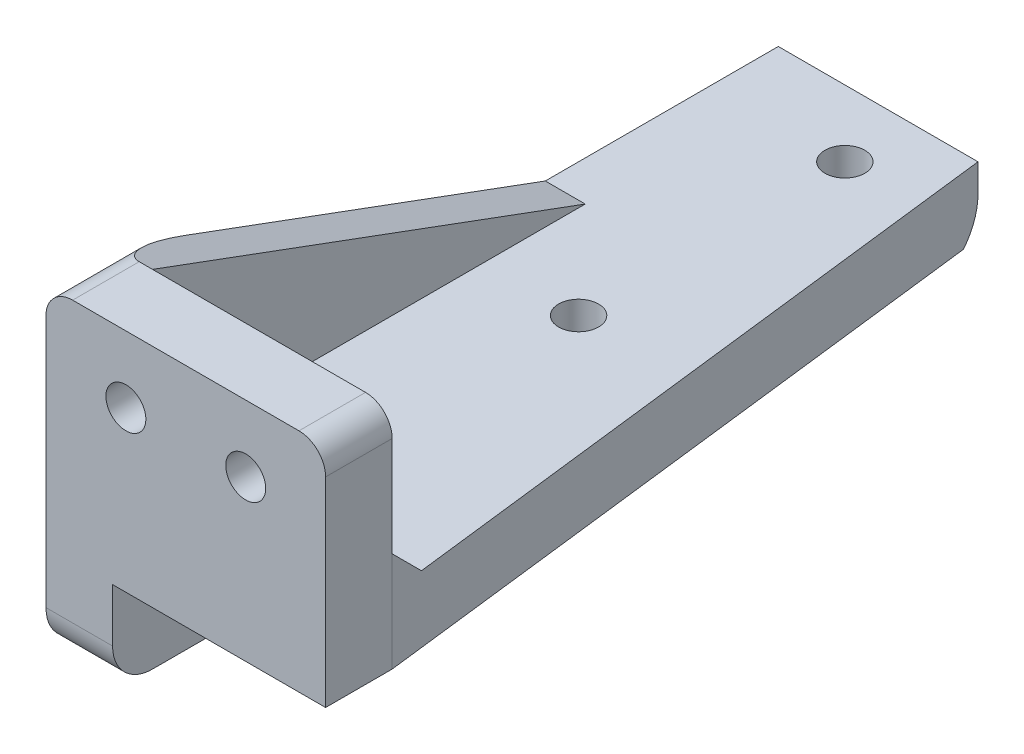
ISO-10303-21;
HEADER;
FILE_DESCRIPTION(('STEP AP214'),'2;1');
FILE_NAME('part.step','',(''),(''),'','','');
FILE_SCHEMA(('AUTOMOTIVE_DESIGN { 1 0 10303 214 1 1 1 1 }'));
ENDSEC;
DATA;
#1=APPLICATION_CONTEXT('core data for automotive mechanical design processes');
#2=APPLICATION_PROTOCOL_DEFINITION('international standard','automotive_design',2000,#1);
#3=PRODUCT_CONTEXT('',#1,'mechanical');
#4=PRODUCT('Part','Part','',(#3));
#5=PRODUCT_RELATED_PRODUCT_CATEGORY('part','',(#4));
#6=PRODUCT_DEFINITION_FORMATION('','',#4);
#7=PRODUCT_DEFINITION_CONTEXT('part definition',#1,'design');
#8=PRODUCT_DEFINITION('design','',#6,#7);
#9=PRODUCT_DEFINITION_SHAPE('','',#8);
#10=(LENGTH_UNIT() NAMED_UNIT(*) SI_UNIT(.MILLI.,.METRE.));
#11=(NAMED_UNIT(*) PLANE_ANGLE_UNIT() SI_UNIT($,.RADIAN.));
#12=(NAMED_UNIT(*) SI_UNIT($,.STERADIAN.) SOLID_ANGLE_UNIT());
#13=UNCERTAINTY_MEASURE_WITH_UNIT(LENGTH_MEASURE(1.E-05),#10,'distance_accuracy_value','');
#14=(GEOMETRIC_REPRESENTATION_CONTEXT(3) GLOBAL_UNCERTAINTY_ASSIGNED_CONTEXT((#13)) GLOBAL_UNIT_ASSIGNED_CONTEXT((#10,
#11,#12)) REPRESENTATION_CONTEXT('',''));
#15=CARTESIAN_POINT('',(0.,0.,0.));
#16=DIRECTION('',(0.,0.,1.));
#17=DIRECTION('',(1.,0.,0.));
#18=AXIS2_PLACEMENT_3D('',#15,#16,#17);
#19=CARTESIAN_POINT('',(0.,0.,0.));
#20=DIRECTION('',(0.,1.,0.));
#21=DIRECTION('',(0.,0.,1.));
#22=AXIS2_PLACEMENT_3D('',#19,#20,#21);
#23=PLANE('',#22);
#24=CARTESIAN_POINT('',(2.5,0.,20.));
#25=DIRECTION('',(0.,-1.,0.));
#26=DIRECTION('',(0.,0.,-1.));
#27=AXIS2_PLACEMENT_3D('',#24,#25,#26);
#28=CIRCLE('',#27,1.5);
#29=CARTESIAN_POINT('',(2.5,0.,18.5));
#30=VERTEX_POINT('',#29);
#31=EDGE_CURVE('E261',#30,#30,#28,.T.);
#32=ORIENTED_EDGE('',*,*,#31,.F.);
#33=EDGE_LOOP('',(#32));
#34=FACE_BOUND('',#33,.T.);
#35=CARTESIAN_POINT('',(2.5,0.,0.));
#36=DIRECTION('',(0.,-1.,0.));
#37=DIRECTION('',(0.,0.,-1.));
#38=AXIS2_PLACEMENT_3D('',#35,#36,#37);
#39=CIRCLE('',#38,1.5);
#40=CARTESIAN_POINT('',(2.5,0.,-1.50000000000001));
#41=VERTEX_POINT('',#40);
#42=EDGE_CURVE('E265',#41,#41,#39,.T.);
#43=ORIENTED_EDGE('',*,*,#42,.F.);
#44=EDGE_LOOP('',(#43));
#45=FACE_BOUND('',#44,.T.);
#46=CARTESIAN_POINT('',(2.5,0.,-20.));
#47=DIRECTION('',(0.,-1.,0.));
#48=DIRECTION('',(0.,0.,-1.));
#49=AXIS2_PLACEMENT_3D('',#46,#47,#48);
#50=CIRCLE('',#49,1.5);
#51=CARTESIAN_POINT('',(2.5,0.,-21.5));
#52=VERTEX_POINT('',#51);
#53=EDGE_CURVE('E273',#52,#52,#50,.T.);
#54=ORIENTED_EDGE('',*,*,#53,.F.);
#55=EDGE_LOOP('',(#54));
#56=FACE_BOUND('',#55,.T.);
#57=DIRECTION('',(0.,0.,1.));
#58=VECTOR('',#57,1.);
#59=CARTESIAN_POINT('',(-2.5,0.,0.));
#60=LINE('',#59,#58);
#61=CARTESIAN_POINT('',(-2.5,0.,-23.7536792787917));
#62=VERTEX_POINT('',#61);
#63=CARTESIAN_POINT('',(-2.5,0.,30.));
#64=VERTEX_POINT('',#63);
#65=EDGE_CURVE('E291',#62,#64,#60,.T.);
#66=ORIENTED_EDGE('',*,*,#65,.F.);
#67=DIRECTION('',(-1.,0.,0.));
#68=VECTOR('',#67,1.);
#69=CARTESIAN_POINT('',(-2.5,0.,-23.7536792787917));
#70=LINE('',#69,#68);
#71=CARTESIAN_POINT('',(7.649558486545,0.,-23.7536792787917));
#72=VERTEX_POINT('',#71);
#73=EDGE_CURVE('E345',#62,#72,#70,.F.);
#74=ORIENTED_EDGE('',*,*,#73,.T.);
#75=DIRECTION('',(-0.119145220618431,0.,-0.992876838486922));
#76=VECTOR('',#75,1.);
#77=CARTESIAN_POINT('',(10.3509463722397,0.,-1.24211356466877));
#78=LINE('',#77,#76);
#79=CARTESIAN_POINT('',(13.5,0.,25.));
#80=VERTEX_POINT('',#79);
#81=EDGE_CURVE('E307',#80,#72,#78,.T.);
#82=ORIENTED_EDGE('',*,*,#81,.F.);
#83=DIRECTION('',(0.,0.,-1.));
#84=VECTOR('',#83,1.);
#85=CARTESIAN_POINT('',(13.5,0.,30.));
#86=LINE('',#85,#84);
#87=CARTESIAN_POINT('',(13.5,0.,30.));
#88=VERTEX_POINT('',#87);
#89=EDGE_CURVE('E247',#88,#80,#86,.T.);
#90=ORIENTED_EDGE('',*,*,#89,.F.);
#91=DIRECTION('',(1.,0.,0.));
#92=VECTOR('',#91,1.);
#93=CARTESIAN_POINT('',(13.5,0.,30.));
#94=LINE('',#93,#92);
#95=EDGE_CURVE('E243',#64,#88,#94,.T.);
#96=ORIENTED_EDGE('',*,*,#95,.F.);
#97=EDGE_LOOP('',(#66,#74,#82,#90,#96));
#98=FACE_BOUND('',#97,.T.);
#99=ADVANCED_FACE('F49',(#34,#45,#56,#98),#23,.F.);
#100=CARTESIAN_POINT('',(10.3509463722397,5.,-1.24211356466877));
#101=DIRECTION('',(-0.992876838486922,0.,0.119145220618431));
#102=DIRECTION('',(0.119145220618431,0.,0.992876838486922));
#103=AXIS2_PLACEMENT_3D('',#100,#101,#102);
#104=PLANE('',#103);
#105=ORIENTED_EDGE('',*,*,#81,.T.);
#106=CARTESIAN_POINT('',(7.98,2.90124980474851,-21.));
#107=DIRECTION('',(-0.992876838486922,0.,0.119145220618431));
#108=DIRECTION('',(-0.119145220618431,0.,-0.992876838486922));
#109=AXIS2_PLACEMENT_3D('',#106,#107,#108);
#110=ELLIPSE('',#109,4.02869705984453,4.);
#111=CARTESIAN_POINT('',(7.5,2.90124980474851,-25.));
#112=VERTEX_POINT('',#111);
#113=EDGE_CURVE('E348',#72,#112,#110,.F.);
#114=ORIENTED_EDGE('',*,*,#113,.T.);
#115=DIRECTION('',(0.,-1.,0.));
#116=VECTOR('',#115,1.);
#117=CARTESIAN_POINT('',(7.5,5.,-25.));
#118=LINE('',#117,#116);
#119=CARTESIAN_POINT('',(7.5,5.,-25.));
#120=VERTEX_POINT('',#119);
#121=EDGE_CURVE('E324',#120,#112,#118,.T.);
#122=ORIENTED_EDGE('',*,*,#121,.F.);
#123=DIRECTION('',(-0.119145220618431,0.,-0.992876838486922));
#124=VECTOR('',#123,1.);
#125=CARTESIAN_POINT('',(10.3509463722397,5.,-1.24211356466877));
#126=LINE('',#125,#124);
#127=CARTESIAN_POINT('',(13.2,5.,22.5));
#128=VERTEX_POINT('',#127);
#129=EDGE_CURVE('E308',#128,#120,#126,.T.);
#130=ORIENTED_EDGE('',*,*,#129,.F.);
#131=DIRECTION('',(-0.0845489833163317,-0.704574860969423,-0.704574860969431));
#132=VECTOR('',#131,1.);
#133=CARTESIAN_POINT('',(11.7652899126291,-6.95591739475773,10.5440826052421));
#134=LINE('',#133,#132);
#135=CARTESIAN_POINT('',(13.5,7.5,25.));
#136=VERTEX_POINT('',#135);
#137=EDGE_CURVE('E373',#128,#136,#134,.F.);
#138=ORIENTED_EDGE('',*,*,#137,.T.);
#139=DIRECTION('',(0.,-1.,0.));
#140=VECTOR('',#139,1.);
#141=CARTESIAN_POINT('',(13.5,5.,25.));
#142=LINE('',#141,#140);
#143=EDGE_CURVE('E328',#136,#80,#142,.T.);
#144=ORIENTED_EDGE('',*,*,#143,.T.);
#145=EDGE_LOOP('',(#105,#114,#122,#130,#138,#144));
#146=FACE_BOUND('',#145,.T.);
#147=ADVANCED_FACE('F427',(#146),#104,.F.);
#148=CARTESIAN_POINT('',(0.,5.,-25.));
#149=DIRECTION('',(0.,0.,-1.));
#150=DIRECTION('',(-1.,0.,0.));
#151=AXIS2_PLACEMENT_3D('',#148,#149,#150);
#152=PLANE('',#151);
#153=ORIENTED_EDGE('',*,*,#121,.T.);
#154=DIRECTION('',(-1.,0.,0.));
#155=VECTOR('',#154,1.);
#156=CARTESIAN_POINT('',(0.,2.90124980474851,-25.));
#157=LINE('',#156,#155);
#158=CARTESIAN_POINT('',(-7.5,2.90124980474851,-25.));
#159=VERTEX_POINT('',#158);
#160=EDGE_CURVE('E332',#112,#159,#157,.T.);
#161=ORIENTED_EDGE('',*,*,#160,.T.);
#162=DIRECTION('',(0.,-1.,0.));
#163=VECTOR('',#162,1.);
#164=CARTESIAN_POINT('',(-7.5,5.,-25.));
#165=LINE('',#164,#163);
#166=CARTESIAN_POINT('',(-7.5,5.,-25.));
#167=VERTEX_POINT('',#166);
#168=EDGE_CURVE('E317',#167,#159,#165,.T.);
#169=ORIENTED_EDGE('',*,*,#168,.F.);
#170=DIRECTION('',(1.,0.,0.));
#171=VECTOR('',#170,1.);
#172=CARTESIAN_POINT('',(0.,5.,-25.));
#173=LINE('',#172,#171);
#174=EDGE_CURVE('E311',#167,#120,#173,.T.);
#175=ORIENTED_EDGE('',*,*,#174,.T.);
#176=EDGE_LOOP('',(#153,#161,#169,#175));
#177=FACE_BOUND('',#176,.T.);
#178=ADVANCED_FACE('F431',(#177),#152,.T.);
#179=CARTESIAN_POINT('',(-7.5,5.,0.));
#180=DIRECTION('',(-1.,0.,0.));
#181=DIRECTION('',(0.,0.,1.));
#182=AXIS2_PLACEMENT_3D('',#179,#180,#181);
#183=PLANE('',#182);
#184=DIRECTION('',(0.,-1.,0.));
#185=VECTOR('',#184,1.);
#186=CARTESIAN_POINT('',(-7.5,5.,30.));
#187=LINE('',#186,#185);
#188=CARTESIAN_POINT('',(-7.5,15.,30.));
#189=VERTEX_POINT('',#188);
#190=CARTESIAN_POINT('',(-7.5,-4.,30.));
#191=VERTEX_POINT('',#190);
#192=EDGE_CURVE('E237',#189,#191,#187,.T.);
#193=ORIENTED_EDGE('',*,*,#192,.F.);
#194=DIRECTION('',(0.,0.,-1.));
#195=VECTOR('',#194,1.);
#196=CARTESIAN_POINT('',(-7.5,15.,25.));
#197=LINE('',#196,#195);
#198=CARTESIAN_POINT('',(-7.5,15.,19.5833333333333));
#199=VERTEX_POINT('',#198);
#200=EDGE_CURVE('E58',#189,#199,#197,.T.);
#201=ORIENTED_EDGE('',*,*,#200,.T.);
#202=DIRECTION('',(0.,-0.346374082759158,-0.938096474139388));
#203=VECTOR('',#202,1.);
#204=CARTESIAN_POINT('',(-7.5,5.,-7.50000000000002));
#205=LINE('',#204,#203);
#206=CARTESIAN_POINT('',(-7.5,5.,-7.50000000000002));
#207=VERTEX_POINT('',#206);
#208=EDGE_CURVE('E197',#199,#207,#205,.T.);
#209=ORIENTED_EDGE('',*,*,#208,.T.);
#210=DIRECTION('',(0.,0.,-1.));
#211=VECTOR('',#210,1.);
#212=CARTESIAN_POINT('',(-7.5,5.,0.));
#213=LINE('',#212,#211);
#214=EDGE_CURVE('E202',#207,#167,#213,.T.);
#215=ORIENTED_EDGE('',*,*,#214,.T.);
#216=ORIENTED_EDGE('',*,*,#168,.T.);
#217=CARTESIAN_POINT('',(-7.5,2.90124980474851,-21.));
#218=DIRECTION('',(-1.,0.,0.));
#219=DIRECTION('',(0.,0.,1.));
#220=AXIS2_PLACEMENT_3D('',#217,#218,#219);
#221=CIRCLE('',#220,4.);
#222=CARTESIAN_POINT('',(-7.5,-1.09750078088398,-21.0999687646408));
#223=VERTEX_POINT('',#222);
#224=EDGE_CURVE('E336',#159,#223,#221,.T.);
#225=ORIENTED_EDGE('',*,*,#224,.T.);
#226=DIRECTION('',(0.,-0.0249921911602029,0.999687646408123));
#227=VECTOR('',#226,1.);
#228=CARTESIAN_POINT('',(-7.5,-1.62398500936915,-0.0405996252342284));
#229=LINE('',#228,#227);
#230=CARTESIAN_POINT('',(-7.5,-2.,15.));
#231=VERTEX_POINT('',#230);
#232=EDGE_CURVE('E260',#223,#231,#229,.T.);
#233=ORIENTED_EDGE('',*,*,#232,.T.);
#234=DIRECTION('',(0.,1.,0.));
#235=VECTOR('',#234,1.);
#236=CARTESIAN_POINT('',(-7.5,0.,15.));
#237=LINE('',#236,#235);
#238=CARTESIAN_POINT('',(-7.5,-5.,15.));
#239=VERTEX_POINT('',#238);
#240=EDGE_CURVE('E299',#239,#231,#237,.T.);
#241=ORIENTED_EDGE('',*,*,#240,.F.);
#242=CARTESIAN_POINT('',(-7.5,-5.,17.));
#243=DIRECTION('',(-1.,0.,0.));
#244=DIRECTION('',(0.,0.,1.));
#245=AXIS2_PLACEMENT_3D('',#242,#243,#244);
#246=CIRCLE('',#245,2.);
#247=CARTESIAN_POINT('',(-7.5,-7.,17.));
#248=VERTEX_POINT('',#247);
#249=EDGE_CURVE('E355',#239,#248,#246,.T.);
#250=ORIENTED_EDGE('',*,*,#249,.T.);
#251=DIRECTION('',(0.,0.,-1.));
#252=VECTOR('',#251,1.);
#253=CARTESIAN_POINT('',(-7.5,-7.,0.));
#254=LINE('',#253,#252);
#255=CARTESIAN_POINT('',(-7.5,-7.,27.));
#256=VERTEX_POINT('',#255);
#257=EDGE_CURVE('E285',#256,#248,#254,.T.);
#258=ORIENTED_EDGE('',*,*,#257,.F.);
#259=CARTESIAN_POINT('',(-7.5,-4.,27.));
#260=DIRECTION('',(-1.,0.,0.));
#261=DIRECTION('',(0.,0.,1.));
#262=AXIS2_PLACEMENT_3D('',#259,#260,#261);
#263=CIRCLE('',#262,3.);
#264=EDGE_CURVE('E387',#256,#191,#263,.T.);
#265=ORIENTED_EDGE('',*,*,#264,.T.);
#266=EDGE_LOOP('',(#193,#201,#209,#215,#216,#225,#233,#241,#250,#258,#265));
#267=FACE_BOUND('',#266,.T.);
#268=ADVANCED_FACE('F410',(#267),#183,.T.);
#269=CARTESIAN_POINT('',(0.,5.,0.));
#270=DIRECTION('',(0.,1.,0.));
#271=DIRECTION('',(0.,0.,1.));
#272=AXIS2_PLACEMENT_3D('',#269,#270,#271);
#273=PLANE('',#272);
#274=DIRECTION('',(-1.,0.,0.));
#275=VECTOR('',#274,1.);
#276=CARTESIAN_POINT('',(-4.5,5.,-7.50000000000002));
#277=LINE('',#276,#275);
#278=CARTESIAN_POINT('',(-4.5,5.,-7.50000000000002));
#279=VERTEX_POINT('',#278);
#280=EDGE_CURVE('E192',#279,#207,#277,.T.);
#281=ORIENTED_EDGE('',*,*,#280,.F.);
#282=DIRECTION('',(0.,0.,1.));
#283=VECTOR('',#282,1.);
#284=CARTESIAN_POINT('',(-4.5,5.,22.5));
#285=LINE('',#284,#283);
#286=CARTESIAN_POINT('',(-4.5,5.,22.5));
#287=VERTEX_POINT('',#286);
#288=EDGE_CURVE('E175',#279,#287,#285,.T.);
#289=ORIENTED_EDGE('',*,*,#288,.T.);
#290=DIRECTION('',(1.,0.,0.));
#291=VECTOR('',#290,1.);
#292=CARTESIAN_POINT('',(13.5,5.,22.5));
#293=LINE('',#292,#291);
#294=EDGE_CURVE('E366',#287,#128,#293,.T.);
#295=ORIENTED_EDGE('',*,*,#294,.T.);
#296=ORIENTED_EDGE('',*,*,#129,.T.);
#297=ORIENTED_EDGE('',*,*,#174,.F.);
#298=ORIENTED_EDGE('',*,*,#214,.F.);
#299=EDGE_LOOP('',(#281,#289,#295,#296,#297,#298));
#300=FACE_BOUND('',#299,.T.);
#301=CARTESIAN_POINT('',(2.5,5.,20.));
#302=DIRECTION('',(0.,-1.,0.));
#303=DIRECTION('',(0.,0.,-1.));
#304=AXIS2_PLACEMENT_3D('',#301,#302,#303);
#305=CIRCLE('',#304,1.5);
#306=CARTESIAN_POINT('',(2.5,5.,18.5));
#307=VERTEX_POINT('',#306);
#308=EDGE_CURVE('E256',#307,#307,#305,.T.);
#309=ORIENTED_EDGE('',*,*,#308,.T.);
#310=EDGE_LOOP('',(#309));
#311=FACE_BOUND('',#310,.T.);
#312=CARTESIAN_POINT('',(2.5,5.,0.));
#313=DIRECTION('',(0.,-1.,0.));
#314=DIRECTION('',(0.,0.,-1.));
#315=AXIS2_PLACEMENT_3D('',#312,#313,#314);
#316=CIRCLE('',#315,1.5);
#317=CARTESIAN_POINT('',(2.5,5.,-1.50000000000001));
#318=VERTEX_POINT('',#317);
#319=EDGE_CURVE('E269',#318,#318,#316,.T.);
#320=ORIENTED_EDGE('',*,*,#319,.T.);
#321=EDGE_LOOP('',(#320));
#322=FACE_BOUND('',#321,.T.);
#323=CARTESIAN_POINT('',(2.5,5.,-20.));
#324=DIRECTION('',(0.,-1.,0.));
#325=DIRECTION('',(0.,0.,-1.));
#326=AXIS2_PLACEMENT_3D('',#323,#324,#325);
#327=CIRCLE('',#326,1.5);
#328=CARTESIAN_POINT('',(2.5,5.,-21.5));
#329=VERTEX_POINT('',#328);
#330=EDGE_CURVE('E255',#329,#329,#327,.T.);
#331=ORIENTED_EDGE('',*,*,#330,.T.);
#332=EDGE_LOOP('',(#331));
#333=FACE_BOUND('',#332,.T.);
#334=ADVANCED_FACE('F199',(#300,#311,#322,#333),#273,.T.);
#335=CARTESIAN_POINT('',(-2.5,-7.,0.));
#336=DIRECTION('',(0.,1.,0.));
#337=DIRECTION('',(0.,0.,1.));
#338=AXIS2_PLACEMENT_3D('',#335,#336,#337);
#339=PLANE('',#338);
#340=DIRECTION('',(0.,0.,-1.));
#341=VECTOR('',#340,1.);
#342=CARTESIAN_POINT('',(-2.5,-7.,0.));
#343=LINE('',#342,#341);
#344=CARTESIAN_POINT('',(-2.5,-7.,27.));
#345=VERTEX_POINT('',#344);
#346=CARTESIAN_POINT('',(-2.5,-7.,17.));
#347=VERTEX_POINT('',#346);
#348=EDGE_CURVE('E288',#345,#347,#343,.T.);
#349=ORIENTED_EDGE('',*,*,#348,.F.);
#350=DIRECTION('',(1.,0.,0.));
#351=VECTOR('',#350,1.);
#352=CARTESIAN_POINT('',(-2.5,-7.,27.));
#353=LINE('',#352,#351);
#354=EDGE_CURVE('E384',#345,#256,#353,.F.);
#355=ORIENTED_EDGE('',*,*,#354,.T.);
#356=ORIENTED_EDGE('',*,*,#257,.T.);
#357=DIRECTION('',(-1.,0.,0.));
#358=VECTOR('',#357,1.);
#359=CARTESIAN_POINT('',(-2.5,-7.,17.));
#360=LINE('',#359,#358);
#361=EDGE_CURVE('E359',#248,#347,#360,.F.);
#362=ORIENTED_EDGE('',*,*,#361,.T.);
#363=EDGE_LOOP('',(#349,#355,#356,#362));
#364=FACE_BOUND('',#363,.T.);
#365=ADVANCED_FACE('F461',(#364),#339,.F.);
#366=CARTESIAN_POINT('',(-2.5,0.,15.));
#367=DIRECTION('',(0.,0.,1.));
#368=DIRECTION('',(0.,-1.,0.));
#369=AXIS2_PLACEMENT_3D('',#366,#367,#368);
#370=PLANE('',#369);
#371=DIRECTION('',(0.,1.,0.));
#372=VECTOR('',#371,1.);
#373=CARTESIAN_POINT('',(-2.5,0.,15.));
#374=LINE('',#373,#372);
#375=CARTESIAN_POINT('',(-2.5,-5.,15.));
#376=VERTEX_POINT('',#375);
#377=CARTESIAN_POINT('',(-2.5,-2.,15.));
#378=VERTEX_POINT('',#377);
#379=EDGE_CURVE('E284',#376,#378,#374,.T.);
#380=ORIENTED_EDGE('',*,*,#379,.F.);
#381=DIRECTION('',(-1.,0.,0.));
#382=VECTOR('',#381,1.);
#383=CARTESIAN_POINT('',(-2.5,-5.,15.));
#384=LINE('',#383,#382);
#385=EDGE_CURVE('E351',#376,#239,#384,.T.);
#386=ORIENTED_EDGE('',*,*,#385,.T.);
#387=ORIENTED_EDGE('',*,*,#240,.T.);
#388=DIRECTION('',(-1.,0.,0.));
#389=VECTOR('',#388,1.);
#390=CARTESIAN_POINT('',(-2.5,-2.,15.));
#391=LINE('',#390,#389);
#392=EDGE_CURVE('E295',#378,#231,#391,.T.);
#393=ORIENTED_EDGE('',*,*,#392,.F.);
#394=EDGE_LOOP('',(#380,#386,#387,#393));
#395=FACE_BOUND('',#394,.T.);
#396=ADVANCED_FACE('F472',(#395),#370,.F.);
#397=CARTESIAN_POINT('',(-2.5,-1.62398500936915,-0.0405996252342284));
#398=DIRECTION('',(0.,-0.999687646408123,-0.0249921911602029));
#399=DIRECTION('',(0.,0.0249921911602029,-0.999687646408123));
#400=AXIS2_PLACEMENT_3D('',#397,#398,#399);
#401=PLANE('',#400);
#402=ORIENTED_EDGE('',*,*,#232,.F.);
#403=DIRECTION('',(-1.,0.,0.));
#404=VECTOR('',#403,1.);
#405=CARTESIAN_POINT('',(-2.5,-1.09750078088398,-21.0999687646408));
#406=LINE('',#405,#404);
#407=CARTESIAN_POINT('',(-2.5,-1.09750078088398,-21.0999687646408));
#408=VERTEX_POINT('',#407);
#409=EDGE_CURVE('E339',#223,#408,#406,.F.);
#410=ORIENTED_EDGE('',*,*,#409,.T.);
#411=DIRECTION('',(0.,-0.0249921911602029,0.999687646408123));
#412=VECTOR('',#411,1.);
#413=CARTESIAN_POINT('',(-2.5,-1.62398500936915,-0.0405996252342284));
#414=LINE('',#413,#412);
#415=EDGE_CURVE('E280',#408,#378,#414,.T.);
#416=ORIENTED_EDGE('',*,*,#415,.T.);
#417=ORIENTED_EDGE('',*,*,#392,.T.);
#418=EDGE_LOOP('',(#402,#410,#416,#417));
#419=FACE_BOUND('',#418,.T.);
#420=ADVANCED_FACE('F438',(#419),#401,.T.);
#421=CARTESIAN_POINT('',(-2.5,0.,0.));
#422=DIRECTION('',(-1.,0.,0.));
#423=DIRECTION('',(0.,0.,1.));
#424=AXIS2_PLACEMENT_3D('',#421,#422,#423);
#425=PLANE('',#424);
#426=DIRECTION('',(0.,1.,0.));
#427=VECTOR('',#426,1.);
#428=CARTESIAN_POINT('',(-2.5,0.,30.));
#429=LINE('',#428,#427);
#430=CARTESIAN_POINT('',(-2.5,-4.,30.));
#431=VERTEX_POINT('',#430);
#432=EDGE_CURVE('E240',#431,#64,#429,.T.);
#433=ORIENTED_EDGE('',*,*,#432,.F.);
#434=CARTESIAN_POINT('',(-2.5,-4.,27.));
#435=DIRECTION('',(-1.,0.,0.));
#436=DIRECTION('',(0.,0.,1.));
#437=AXIS2_PLACEMENT_3D('',#434,#435,#436);
#438=CIRCLE('',#437,3.);
#439=EDGE_CURVE('E381',#431,#345,#438,.F.);
#440=ORIENTED_EDGE('',*,*,#439,.T.);
#441=ORIENTED_EDGE('',*,*,#348,.T.);
#442=CARTESIAN_POINT('',(-2.5,-5.,17.));
#443=DIRECTION('',(-1.,0.,0.));
#444=DIRECTION('',(0.,0.,1.));
#445=AXIS2_PLACEMENT_3D('',#442,#443,#444);
#446=CIRCLE('',#445,2.);
#447=EDGE_CURVE('E363',#347,#376,#446,.F.);
#448=ORIENTED_EDGE('',*,*,#447,.T.);
#449=ORIENTED_EDGE('',*,*,#379,.T.);
#450=ORIENTED_EDGE('',*,*,#415,.F.);
#451=CARTESIAN_POINT('',(-2.5,2.90124980474851,-21.));
#452=DIRECTION('',(-1.,0.,0.));
#453=DIRECTION('',(0.,0.,1.));
#454=AXIS2_PLACEMENT_3D('',#451,#452,#453);
#455=CIRCLE('',#454,4.);
#456=EDGE_CURVE('E342',#408,#62,#455,.F.);
#457=ORIENTED_EDGE('',*,*,#456,.T.);
#458=ORIENTED_EDGE('',*,*,#65,.T.);
#459=EDGE_LOOP('',(#433,#440,#441,#448,#449,#450,#457,#458));
#460=FACE_BOUND('',#459,.T.);
#461=ADVANCED_FACE('F448',(#460),#425,.F.);
#462=CARTESIAN_POINT('',(0.,2.90124980474851,-21.));
#463=DIRECTION('',(-1.,0.,0.));
#464=DIRECTION('',(0.,0.,1.));
#465=AXIS2_PLACEMENT_3D('',#462,#463,#464);
#466=CYLINDRICAL_SURFACE('',#465,4.);
#467=ORIENTED_EDGE('',*,*,#456,.F.);
#468=ORIENTED_EDGE('',*,*,#409,.F.);
#469=ORIENTED_EDGE('',*,*,#224,.F.);
#470=ORIENTED_EDGE('',*,*,#160,.F.);
#471=ORIENTED_EDGE('',*,*,#113,.F.);
#472=ORIENTED_EDGE('',*,*,#73,.F.);
#473=EDGE_LOOP('',(#467,#468,#469,#470,#471,#472));
#474=FACE_BOUND('',#473,.T.);
#475=ADVANCED_FACE('F442',(#474),#466,.T.);
#476=CARTESIAN_POINT('',(-2.5,-5.,17.));
#477=DIRECTION('',(-1.,0.,0.));
#478=DIRECTION('',(0.,0.,1.));
#479=AXIS2_PLACEMENT_3D('',#476,#477,#478);
#480=CYLINDRICAL_SURFACE('',#479,2.);
#481=ORIENTED_EDGE('',*,*,#447,.F.);
#482=ORIENTED_EDGE('',*,*,#361,.F.);
#483=ORIENTED_EDGE('',*,*,#249,.F.);
#484=ORIENTED_EDGE('',*,*,#385,.F.);
#485=EDGE_LOOP('',(#481,#482,#483,#484));
#486=FACE_BOUND('',#485,.T.);
#487=ADVANCED_FACE('F469',(#486),#480,.T.);
#488=CARTESIAN_POINT('',(2.5,5.,-20.));
#489=DIRECTION('',(0.,-1.,0.));
#490=DIRECTION('',(0.,0.,-1.));
#491=AXIS2_PLACEMENT_3D('',#488,#489,#490);
#492=CYLINDRICAL_SURFACE('',#491,1.5);
#493=ORIENTED_EDGE('',*,*,#330,.F.);
#494=EDGE_LOOP('',(#493));
#495=FACE_BOUND('',#494,.T.);
#496=ORIENTED_EDGE('',*,*,#53,.T.);
#497=EDGE_LOOP('',(#496));
#498=FACE_BOUND('',#497,.T.);
#499=ADVANCED_FACE('F500',(#495,#498),#492,.F.);
#500=CARTESIAN_POINT('',(2.5,5.,0.));
#501=DIRECTION('',(0.,-1.,0.));
#502=DIRECTION('',(0.,0.,-1.));
#503=AXIS2_PLACEMENT_3D('',#500,#501,#502);
#504=CYLINDRICAL_SURFACE('',#503,1.5);
#505=ORIENTED_EDGE('',*,*,#319,.F.);
#506=EDGE_LOOP('',(#505));
#507=FACE_BOUND('',#506,.T.);
#508=ORIENTED_EDGE('',*,*,#42,.T.);
#509=EDGE_LOOP('',(#508));
#510=FACE_BOUND('',#509,.T.);
#511=ADVANCED_FACE('F535',(#507,#510),#504,.F.);
#512=CARTESIAN_POINT('',(2.5,5.,20.));
#513=DIRECTION('',(0.,-1.,0.));
#514=DIRECTION('',(0.,0.,-1.));
#515=AXIS2_PLACEMENT_3D('',#512,#513,#514);
#516=CYLINDRICAL_SURFACE('',#515,1.5);
#517=ORIENTED_EDGE('',*,*,#308,.F.);
#518=EDGE_LOOP('',(#517));
#519=FACE_BOUND('',#518,.T.);
#520=ORIENTED_EDGE('',*,*,#31,.T.);
#521=EDGE_LOOP('',(#520));
#522=FACE_BOUND('',#521,.T.);
#523=ADVANCED_FACE('F532',(#519,#522),#516,.F.);
#524=CARTESIAN_POINT('',(0.,0.,25.));
#525=DIRECTION('',(0.,0.,-1.));
#526=DIRECTION('',(-1.,0.,0.));
#527=AXIS2_PLACEMENT_3D('',#524,#525,#526);
#528=PLANE('',#527);
#529=DIRECTION('',(-1.,0.,0.));
#530=VECTOR('',#529,1.);
#531=CARTESIAN_POINT('',(-7.5,17.,25.));
#532=LINE('',#531,#530);
#533=CARTESIAN_POINT('',(11.5,17.,25.));
#534=VERTEX_POINT('',#533);
#535=CARTESIAN_POINT('',(-4.5,17.,25.));
#536=VERTEX_POINT('',#535);
#537=EDGE_CURVE('E225',#534,#536,#532,.T.);
#538=ORIENTED_EDGE('',*,*,#537,.F.);
#539=CARTESIAN_POINT('',(11.5,15.,25.));
#540=DIRECTION('',(0.,0.,-1.));
#541=DIRECTION('',(-1.,0.,0.));
#542=AXIS2_PLACEMENT_3D('',#539,#540,#541);
#543=CIRCLE('',#542,2.);
#544=CARTESIAN_POINT('',(13.5,15.,25.));
#545=VERTEX_POINT('',#544);
#546=EDGE_CURVE('E398',#534,#545,#543,.T.);
#547=ORIENTED_EDGE('',*,*,#546,.T.);
#548=DIRECTION('',(0.,1.,0.));
#549=VECTOR('',#548,1.);
#550=CARTESIAN_POINT('',(13.5,5.,25.));
#551=LINE('',#550,#549);
#552=EDGE_CURVE('E234',#136,#545,#551,.T.);
#553=ORIENTED_EDGE('',*,*,#552,.F.);
#554=DIRECTION('',(-1.,0.,0.));
#555=VECTOR('',#554,1.);
#556=CARTESIAN_POINT('',(-7.5,7.5,25.));
#557=LINE('',#556,#555);
#558=CARTESIAN_POINT('',(-4.5,7.5,25.));
#559=VERTEX_POINT('',#558);
#560=EDGE_CURVE('E369',#136,#559,#557,.T.);
#561=ORIENTED_EDGE('',*,*,#560,.T.);
#562=DIRECTION('',(0.,1.,0.));
#563=VECTOR('',#562,1.);
#564=CARTESIAN_POINT('',(-4.5,17.,25.));
#565=LINE('',#564,#563);
#566=EDGE_CURVE('E204',#559,#536,#565,.T.);
#567=ORIENTED_EDGE('',*,*,#566,.T.);
#568=EDGE_LOOP('',(#538,#547,#553,#561,#567));
#569=FACE_BOUND('',#568,.T.);
#570=CARTESIAN_POINT('',(7.5,12.,25.));
#571=DIRECTION('',(0.,0.,1.));
#572=DIRECTION('',(1.,0.,0.));
#573=AXIS2_PLACEMENT_3D('',#570,#571,#572);
#574=CIRCLE('',#573,1.5);
#575=CARTESIAN_POINT('',(9.,12.,25.));
#576=VERTEX_POINT('',#575);
#577=EDGE_CURVE('E208',#576,#576,#574,.T.);
#578=ORIENTED_EDGE('',*,*,#577,.T.);
#579=EDGE_LOOP('',(#578));
#580=FACE_BOUND('',#579,.T.);
#581=CARTESIAN_POINT('',(-1.5,12.,25.));
#582=DIRECTION('',(0.,0.,1.));
#583=DIRECTION('',(1.,0.,0.));
#584=AXIS2_PLACEMENT_3D('',#581,#582,#583);
#585=CIRCLE('',#584,1.5);
#586=CARTESIAN_POINT('',(0.,12.,25.));
#587=VERTEX_POINT('',#586);
#588=EDGE_CURVE('E217',#587,#587,#585,.T.);
#589=ORIENTED_EDGE('',*,*,#588,.T.);
#590=EDGE_LOOP('',(#589));
#591=FACE_BOUND('',#590,.T.);
#592=ADVANCED_FACE('F421',(#569,#580,#591),#528,.T.);
#593=CARTESIAN_POINT('',(0.,0.,30.));
#594=DIRECTION('',(0.,0.,-1.));
#595=DIRECTION('',(-1.,0.,0.));
#596=AXIS2_PLACEMENT_3D('',#593,#594,#595);
#597=PLANE('',#596);
#598=DIRECTION('',(0.,1.,0.));
#599=VECTOR('',#598,1.);
#600=CARTESIAN_POINT('',(13.5,17.,30.));
#601=LINE('',#600,#599);
#602=CARTESIAN_POINT('',(13.5,15.,30.));
#603=VERTEX_POINT('',#602);
#604=EDGE_CURVE('E229',#88,#603,#601,.T.);
#605=ORIENTED_EDGE('',*,*,#604,.T.);
#606=CARTESIAN_POINT('',(11.5,15.,30.));
#607=DIRECTION('',(0.,0.,-1.));
#608=DIRECTION('',(-1.,0.,0.));
#609=AXIS2_PLACEMENT_3D('',#606,#607,#608);
#610=CIRCLE('',#609,2.);
#611=CARTESIAN_POINT('',(11.5,17.,30.));
#612=VERTEX_POINT('',#611);
#613=EDGE_CURVE('E406',#603,#612,#610,.F.);
#614=ORIENTED_EDGE('',*,*,#613,.T.);
#615=DIRECTION('',(-1.,0.,0.));
#616=VECTOR('',#615,1.);
#617=CARTESIAN_POINT('',(-7.5,17.,30.));
#618=LINE('',#617,#616);
#619=CARTESIAN_POINT('',(-5.5,17.,30.));
#620=VERTEX_POINT('',#619);
#621=EDGE_CURVE('E233',#612,#620,#618,.T.);
#622=ORIENTED_EDGE('',*,*,#621,.T.);
#623=CARTESIAN_POINT('',(-5.5,15.,30.));
#624=DIRECTION('',(0.,0.,-1.));
#625=DIRECTION('',(-1.,0.,0.));
#626=AXIS2_PLACEMENT_3D('',#623,#624,#625);
#627=CIRCLE('',#626,2.);
#628=EDGE_CURVE('E71',#620,#189,#627,.F.);
#629=ORIENTED_EDGE('',*,*,#628,.T.);
#630=ORIENTED_EDGE('',*,*,#192,.T.);
#631=DIRECTION('',(1.,0.,0.));
#632=VECTOR('',#631,1.);
#633=CARTESIAN_POINT('',(0.,-4.,30.));
#634=LINE('',#633,#632);
#635=EDGE_CURVE('E377',#191,#431,#634,.T.);
#636=ORIENTED_EDGE('',*,*,#635,.T.);
#637=ORIENTED_EDGE('',*,*,#432,.T.);
#638=ORIENTED_EDGE('',*,*,#95,.T.);
#639=EDGE_LOOP('',(#605,#614,#622,#629,#630,#636,#637,#638));
#640=FACE_BOUND('',#639,.T.);
#641=CARTESIAN_POINT('',(-1.5,12.,30.));
#642=DIRECTION('',(0.,0.,1.));
#643=DIRECTION('',(1.,0.,0.));
#644=AXIS2_PLACEMENT_3D('',#641,#642,#643);
#645=CIRCLE('',#644,1.5);
#646=CARTESIAN_POINT('',(0.,12.,30.));
#647=VERTEX_POINT('',#646);
#648=EDGE_CURVE('E221',#647,#647,#645,.T.);
#649=ORIENTED_EDGE('',*,*,#648,.F.);
#650=EDGE_LOOP('',(#649));
#651=FACE_BOUND('',#650,.T.);
#652=CARTESIAN_POINT('',(7.5,12.,30.));
#653=DIRECTION('',(0.,0.,1.));
#654=DIRECTION('',(1.,0.,0.));
#655=AXIS2_PLACEMENT_3D('',#652,#653,#654);
#656=CIRCLE('',#655,1.5);
#657=CARTESIAN_POINT('',(9.,12.,30.));
#658=VERTEX_POINT('',#657);
#659=EDGE_CURVE('E213',#658,#658,#656,.T.);
#660=ORIENTED_EDGE('',*,*,#659,.F.);
#661=EDGE_LOOP('',(#660));
#662=FACE_BOUND('',#661,.T.);
#663=ADVANCED_FACE('F453',(#640,#651,#662),#597,.F.);
#664=CARTESIAN_POINT('',(-7.5,17.,30.));
#665=DIRECTION('',(0.,-1.,0.));
#666=DIRECTION('',(0.,0.,-1.));
#667=AXIS2_PLACEMENT_3D('',#664,#665,#666);
#668=PLANE('',#667);
#669=ORIENTED_EDGE('',*,*,#621,.F.);
#670=DIRECTION('',(0.,0.,-1.));
#671=VECTOR('',#670,1.);
#672=CARTESIAN_POINT('',(11.5,17.,30.));
#673=LINE('',#672,#671);
#674=EDGE_CURVE('E394',#612,#534,#673,.T.);
#675=ORIENTED_EDGE('',*,*,#674,.T.);
#676=ORIENTED_EDGE('',*,*,#537,.T.);
#677=DIRECTION('',(-1.,0.,0.));
#678=VECTOR('',#677,1.);
#679=CARTESIAN_POINT('',(-4.5,17.,25.));
#680=LINE('',#679,#678);
#681=CARTESIAN_POINT('',(-5.5,17.,25.));
#682=VERTEX_POINT('',#681);
#683=EDGE_CURVE('E195',#536,#682,#680,.T.);
#684=ORIENTED_EDGE('',*,*,#683,.T.);
#685=DIRECTION('',(0.,0.,-1.));
#686=VECTOR('',#685,1.);
#687=CARTESIAN_POINT('',(-5.5,17.,30.));
#688=LINE('',#687,#686);
#689=EDGE_CURVE('E391',#682,#620,#688,.F.);
#690=ORIENTED_EDGE('',*,*,#689,.T.);
#691=EDGE_LOOP('',(#669,#675,#676,#684,#690));
#692=FACE_BOUND('',#691,.T.);
#693=ADVANCED_FACE('F519',(#692),#668,.F.);
#694=CARTESIAN_POINT('',(13.5,5.,30.));
#695=DIRECTION('',(-1.,0.,0.));
#696=DIRECTION('',(0.,0.,1.));
#697=AXIS2_PLACEMENT_3D('',#694,#695,#696);
#698=PLANE('',#697);
#699=ORIENTED_EDGE('',*,*,#552,.T.);
#700=DIRECTION('',(0.,0.,-1.));
#701=VECTOR('',#700,1.);
#702=CARTESIAN_POINT('',(13.5,15.,30.));
#703=LINE('',#702,#701);
#704=EDGE_CURVE('E401',#545,#603,#703,.F.);
#705=ORIENTED_EDGE('',*,*,#704,.T.);
#706=ORIENTED_EDGE('',*,*,#604,.F.);
#707=ORIENTED_EDGE('',*,*,#89,.T.);
#708=ORIENTED_EDGE('',*,*,#143,.F.);
#709=EDGE_LOOP('',(#699,#705,#706,#707,#708));
#710=FACE_BOUND('',#709,.T.);
#711=ADVANCED_FACE('F521',(#710),#698,.F.);
#712=CARTESIAN_POINT('',(-1.5,12.,30.));
#713=DIRECTION('',(0.,0.,-1.));
#714=DIRECTION('',(-1.,0.,0.));
#715=AXIS2_PLACEMENT_3D('',#712,#713,#714);
#716=CYLINDRICAL_SURFACE('',#715,1.5);
#717=ORIENTED_EDGE('',*,*,#648,.T.);
#718=EDGE_LOOP('',(#717));
#719=FACE_BOUND('',#718,.T.);
#720=ORIENTED_EDGE('',*,*,#588,.F.);
#721=EDGE_LOOP('',(#720));
#722=FACE_BOUND('',#721,.T.);
#723=ADVANCED_FACE('F527',(#719,#722),#716,.F.);
#724=CARTESIAN_POINT('',(7.5,12.,30.));
#725=DIRECTION('',(0.,0.,-1.));
#726=DIRECTION('',(-1.,0.,0.));
#727=AXIS2_PLACEMENT_3D('',#724,#725,#726);
#728=CYLINDRICAL_SURFACE('',#727,1.5);
#729=ORIENTED_EDGE('',*,*,#659,.T.);
#730=EDGE_LOOP('',(#729));
#731=FACE_BOUND('',#730,.T.);
#732=ORIENTED_EDGE('',*,*,#577,.F.);
#733=EDGE_LOOP('',(#732));
#734=FACE_BOUND('',#733,.T.);
#735=ADVANCED_FACE('F506',(#731,#734),#728,.F.);
#736=CARTESIAN_POINT('',(0.,5.,22.5));
#737=DIRECTION('',(0.,0.707106781186551,-0.707106781186543));
#738=DIRECTION('',(-1.,0.,0.));
#739=AXIS2_PLACEMENT_3D('',#736,#737,#738);
#740=PLANE('',#739);
#741=ORIENTED_EDGE('',*,*,#294,.F.);
#742=DIRECTION('',(0.,0.707106781186544,0.707106781186551));
#743=VECTOR('',#742,1.);
#744=CARTESIAN_POINT('',(-4.5,7.5,25.));
#745=LINE('',#744,#743);
#746=EDGE_CURVE('E181',#287,#559,#745,.T.);
#747=ORIENTED_EDGE('',*,*,#746,.T.);
#748=ORIENTED_EDGE('',*,*,#560,.F.);
#749=ORIENTED_EDGE('',*,*,#137,.F.);
#750=EDGE_LOOP('',(#741,#747,#748,#749));
#751=FACE_BOUND('',#750,.T.);
#752=ADVANCED_FACE('F416',(#751),#740,.T.);
#753=CARTESIAN_POINT('',(0.,-4.,27.));
#754=DIRECTION('',(1.,0.,0.));
#755=DIRECTION('',(0.,0.,-1.));
#756=AXIS2_PLACEMENT_3D('',#753,#754,#755);
#757=CYLINDRICAL_SURFACE('',#756,3.);
#758=ORIENTED_EDGE('',*,*,#264,.F.);
#759=ORIENTED_EDGE('',*,*,#354,.F.);
#760=ORIENTED_EDGE('',*,*,#439,.F.);
#761=ORIENTED_EDGE('',*,*,#635,.F.);
#762=EDGE_LOOP('',(#758,#759,#760,#761));
#763=FACE_BOUND('',#762,.T.);
#764=ADVANCED_FACE('F466',(#763),#757,.T.);
#765=CARTESIAN_POINT('',(-4.5,5.,-7.50000000000002));
#766=DIRECTION('',(0.,0.938096474139388,-0.346374082759158));
#767=DIRECTION('',(0.,0.346374082759158,0.938096474139388));
#768=AXIS2_PLACEMENT_3D('',#765,#766,#767);
#769=PLANE('',#768);
#770=ORIENTED_EDGE('',*,*,#208,.F.);
#771=CARTESIAN_POINT('',(-5.5,15.,19.5833333333333));
#772=DIRECTION('',(0.,0.938096474139388,-0.346374082759158));
#773=DIRECTION('',(0.,0.346374082759158,0.938096474139388));
#774=AXIS2_PLACEMENT_3D('',#771,#772,#773);
#775=ELLIPSE('',#774,5.77410406710667,2.);
#776=EDGE_CURVE('E12',#199,#682,#775,.T.);
#777=ORIENTED_EDGE('',*,*,#776,.T.);
#778=ORIENTED_EDGE('',*,*,#683,.F.);
#779=DIRECTION('',(0.,-0.346374082759158,-0.938096474139388));
#780=VECTOR('',#779,1.);
#781=CARTESIAN_POINT('',(-4.5,5.,-7.50000000000002));
#782=LINE('',#781,#780);
#783=EDGE_CURVE('E178',#536,#279,#782,.T.);
#784=ORIENTED_EDGE('',*,*,#783,.T.);
#785=ORIENTED_EDGE('',*,*,#280,.T.);
#786=EDGE_LOOP('',(#770,#777,#778,#784,#785));
#787=FACE_BOUND('',#786,.T.);
#788=ADVANCED_FACE('F191',(#787),#769,.T.);
#789=CARTESIAN_POINT('',(-4.5,0.,0.));
#790=DIRECTION('',(1.,0.,0.));
#791=DIRECTION('',(0.,0.,-1.));
#792=AXIS2_PLACEMENT_3D('',#789,#790,#791);
#793=PLANE('',#792);
#794=ORIENTED_EDGE('',*,*,#783,.F.);
#795=ORIENTED_EDGE('',*,*,#566,.F.);
#796=ORIENTED_EDGE('',*,*,#746,.F.);
#797=ORIENTED_EDGE('',*,*,#288,.F.);
#798=EDGE_LOOP('',(#794,#795,#796,#797));
#799=FACE_BOUND('',#798,.T.);
#800=ADVANCED_FACE('F177',(#799),#793,.T.);
#801=CARTESIAN_POINT('',(11.5,15.,30.));
#802=DIRECTION('',(0.,0.,-1.));
#803=DIRECTION('',(-1.,0.,0.));
#804=AXIS2_PLACEMENT_3D('',#801,#802,#803);
#805=CYLINDRICAL_SURFACE('',#804,2.);
#806=ORIENTED_EDGE('',*,*,#613,.F.);
#807=ORIENTED_EDGE('',*,*,#704,.F.);
#808=ORIENTED_EDGE('',*,*,#546,.F.);
#809=ORIENTED_EDGE('',*,*,#674,.F.);
#810=EDGE_LOOP('',(#806,#807,#808,#809));
#811=FACE_BOUND('',#810,.T.);
#812=ADVANCED_FACE('F508',(#811),#805,.T.);
#813=CARTESIAN_POINT('',(-5.5,15.,0.));
#814=DIRECTION('',(0.,0.,1.));
#815=DIRECTION('',(1.,0.,0.));
#816=AXIS2_PLACEMENT_3D('',#813,#814,#815);
#817=CYLINDRICAL_SURFACE('',#816,2.);
#818=ORIENTED_EDGE('',*,*,#628,.F.);
#819=ORIENTED_EDGE('',*,*,#689,.F.);
#820=ORIENTED_EDGE('',*,*,#776,.F.);
#821=ORIENTED_EDGE('',*,*,#200,.F.);
#822=EDGE_LOOP('',(#818,#819,#820,#821));
#823=FACE_BOUND('',#822,.T.);
#824=ADVANCED_FACE('F51',(#823),#817,.T.);
#825=CLOSED_SHELL('',(#99,#147,#178,#268,#334,#365,#396,#420,#461,#475,#487,#499,#511,#523,#592,
#663,#693,#711,#723,#735,#752,#764,#788,#800,#812,#824));
#826=MANIFOLD_SOLID_BREP('B2',#825);
#827=ADVANCED_BREP_SHAPE_REPRESENTATION('',(#18,#826),#14);
#828=SHAPE_DEFINITION_REPRESENTATION(#9,#827);
ENDSEC;
END-ISO-10303-21;
